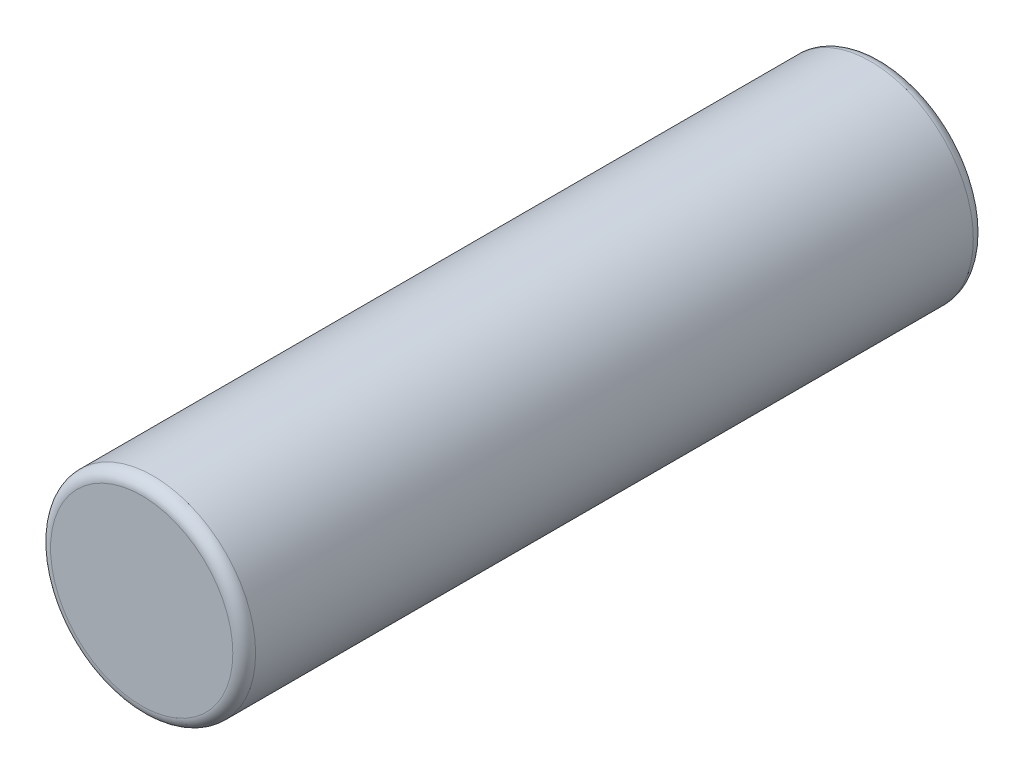
ISO-10303-21;
HEADER;
FILE_DESCRIPTION(('STEP AP214'),'2;1');
FILE_NAME('part.step','',(''),(''),'','','');
FILE_SCHEMA(('AUTOMOTIVE_DESIGN { 1 0 10303 214 1 1 1 1 }'));
ENDSEC;
DATA;
#1=APPLICATION_CONTEXT('core data for automotive mechanical design processes');
#2=APPLICATION_PROTOCOL_DEFINITION('international standard','automotive_design',2000,#1);
#3=PRODUCT_CONTEXT('',#1,'mechanical');
#4=PRODUCT('Part','Part','',(#3));
#5=PRODUCT_RELATED_PRODUCT_CATEGORY('part','',(#4));
#6=PRODUCT_DEFINITION_FORMATION('','',#4);
#7=PRODUCT_DEFINITION_CONTEXT('part definition',#1,'design');
#8=PRODUCT_DEFINITION('design','',#6,#7);
#9=PRODUCT_DEFINITION_SHAPE('','',#8);
#10=(LENGTH_UNIT() NAMED_UNIT(*) SI_UNIT(.MILLI.,.METRE.));
#11=(NAMED_UNIT(*) PLANE_ANGLE_UNIT() SI_UNIT($,.RADIAN.));
#12=(NAMED_UNIT(*) SI_UNIT($,.STERADIAN.) SOLID_ANGLE_UNIT());
#13=UNCERTAINTY_MEASURE_WITH_UNIT(LENGTH_MEASURE(1.E-05),#10,'distance_accuracy_value','');
#14=(GEOMETRIC_REPRESENTATION_CONTEXT(3) GLOBAL_UNCERTAINTY_ASSIGNED_CONTEXT((#13)) GLOBAL_UNIT_ASSIGNED_CONTEXT((#10,
#11,#12)) REPRESENTATION_CONTEXT('',''));
#15=CARTESIAN_POINT('',(0.,0.,0.));
#16=DIRECTION('',(0.,0.,1.));
#17=DIRECTION('',(1.,0.,0.));
#18=AXIS2_PLACEMENT_3D('',#15,#16,#17);
#19=CARTESIAN_POINT('',(0.,0.,65.));
#20=DIRECTION('',(0.,0.,-1.));
#21=DIRECTION('',(-1.,0.,0.));
#22=AXIS2_PLACEMENT_3D('',#19,#20,#21);
#23=CYLINDRICAL_SURFACE('',#22,9.);
#24=CARTESIAN_POINT('',(0.,0.,1.));
#25=DIRECTION('',(0.,0.,1.));
#26=DIRECTION('',(1.,0.,0.));
#27=AXIS2_PLACEMENT_3D('',#24,#25,#26);
#28=CIRCLE('',#27,9.);
#29=CARTESIAN_POINT('',(9.,0.,1.));
#30=VERTEX_POINT('',#29);
#31=EDGE_CURVE('E45',#30,#30,#28,.T.);
#32=ORIENTED_EDGE('',*,*,#31,.T.);
#33=EDGE_LOOP('',(#32));
#34=FACE_BOUND('',#33,.T.);
#35=CARTESIAN_POINT('',(0.,0.,64.));
#36=DIRECTION('',(0.,0.,1.));
#37=DIRECTION('',(1.,0.,0.));
#38=AXIS2_PLACEMENT_3D('',#35,#36,#37);
#39=CIRCLE('',#38,9.);
#40=CARTESIAN_POINT('',(9.,0.,64.));
#41=VERTEX_POINT('',#40);
#42=EDGE_CURVE('E49',#41,#41,#39,.F.);
#43=ORIENTED_EDGE('',*,*,#42,.T.);
#44=EDGE_LOOP('',(#43));
#45=FACE_BOUND('',#44,.T.);
#46=ADVANCED_FACE('F34',(#34,#45),#23,.T.);
#47=CARTESIAN_POINT('',(0.,0.,65.));
#48=DIRECTION('',(0.,0.,1.));
#49=DIRECTION('',(1.,0.,0.));
#50=AXIS2_PLACEMENT_3D('',#47,#48,#49);
#51=PLANE('',#50);
#52=CARTESIAN_POINT('',(0.,0.,65.));
#53=DIRECTION('',(0.,0.,1.));
#54=DIRECTION('',(1.,0.,0.));
#55=AXIS2_PLACEMENT_3D('',#52,#53,#54);
#56=CIRCLE('',#55,8.);
#57=CARTESIAN_POINT('',(8.,0.,65.));
#58=VERTEX_POINT('',#57);
#59=EDGE_CURVE('E10',#58,#58,#56,.T.);
#60=ORIENTED_EDGE('',*,*,#59,.T.);
#61=EDGE_LOOP('',(#60));
#62=FACE_BOUND('',#61,.T.);
#63=ADVANCED_FACE('F65',(#62),#51,.T.);
#64=CARTESIAN_POINT('',(0.,0.,0.));
#65=DIRECTION('',(0.,0.,1.));
#66=DIRECTION('',(1.,0.,0.));
#67=AXIS2_PLACEMENT_3D('',#64,#65,#66);
#68=PLANE('',#67);
#69=CARTESIAN_POINT('',(0.,0.,0.));
#70=DIRECTION('',(0.,0.,1.));
#71=DIRECTION('',(1.,0.,0.));
#72=AXIS2_PLACEMENT_3D('',#69,#70,#71);
#73=CIRCLE('',#72,8.);
#74=CARTESIAN_POINT('',(8.,0.,0.));
#75=VERTEX_POINT('',#74);
#76=EDGE_CURVE('E41',#75,#75,#73,.F.);
#77=ORIENTED_EDGE('',*,*,#76,.T.);
#78=EDGE_LOOP('',(#77));
#79=FACE_BOUND('',#78,.T.);
#80=ADVANCED_FACE('F62',(#79),#68,.F.);
#81=CARTESIAN_POINT('',(0.,0.,1.));
#82=DIRECTION('',(0.,0.,1.));
#83=DIRECTION('',(1.,0.,0.));
#84=AXIS2_PLACEMENT_3D('',#81,#82,#83);
#85=TOROIDAL_SURFACE('',#84,8.,1.);
#86=ORIENTED_EDGE('',*,*,#76,.F.);
#87=EDGE_LOOP('',(#86));
#88=FACE_BOUND('',#87,.T.);
#89=ORIENTED_EDGE('',*,*,#31,.F.);
#90=EDGE_LOOP('',(#89));
#91=FACE_BOUND('',#90,.T.);
#92=ADVANCED_FACE('F58',(#88,#91),#85,.T.);
#93=CARTESIAN_POINT('',(0.,0.,64.));
#94=DIRECTION('',(0.,0.,1.));
#95=DIRECTION('',(1.,0.,0.));
#96=AXIS2_PLACEMENT_3D('',#93,#94,#95);
#97=TOROIDAL_SURFACE('',#96,8.,1.);
#98=ORIENTED_EDGE('',*,*,#42,.F.);
#99=EDGE_LOOP('',(#98));
#100=FACE_BOUND('',#99,.T.);
#101=ORIENTED_EDGE('',*,*,#59,.F.);
#102=EDGE_LOOP('',(#101));
#103=FACE_BOUND('',#102,.T.);
#104=ADVANCED_FACE('F36',(#100,#103),#97,.T.);
#105=CLOSED_SHELL('',(#46,#63,#80,#92,#104));
#106=MANIFOLD_SOLID_BREP('B2',#105);
#107=ADVANCED_BREP_SHAPE_REPRESENTATION('',(#18,#106),#14);
#108=SHAPE_DEFINITION_REPRESENTATION(#9,#107);
ENDSEC;
END-ISO-10303-21;
